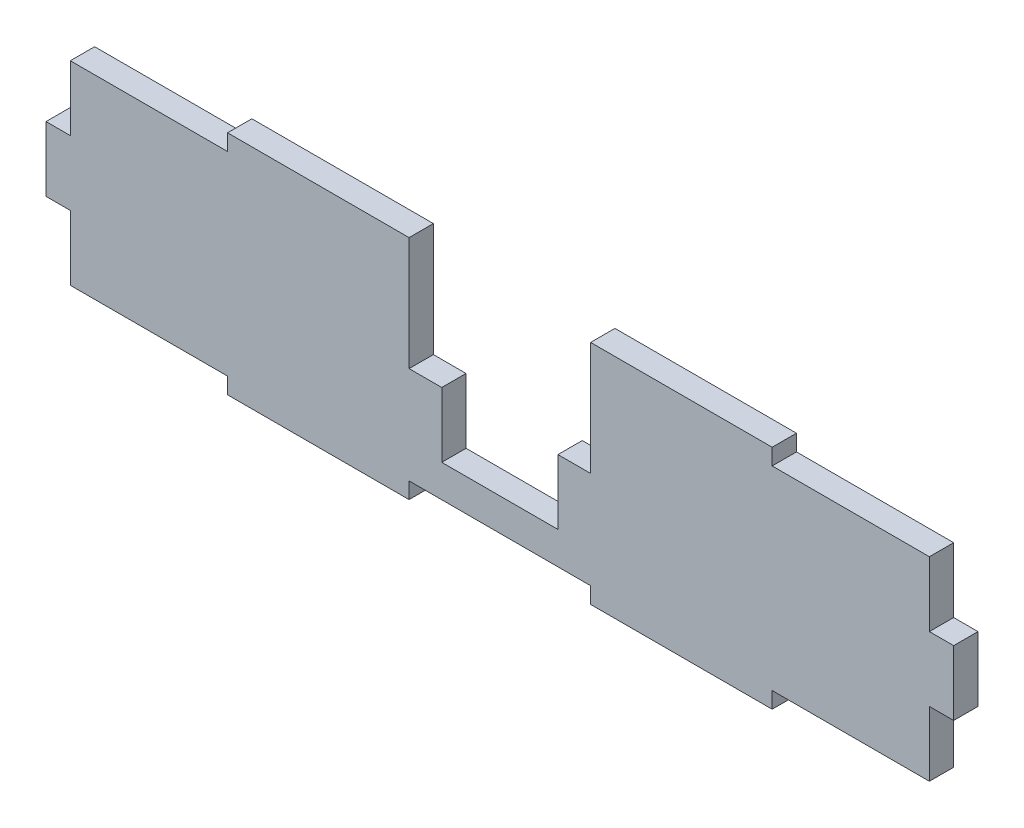
ISO-10303-21;
HEADER;
FILE_DESCRIPTION(('STEP AP214'),'2;1');
FILE_NAME('part.step','',(''),(''),'','','');
FILE_SCHEMA(('AUTOMOTIVE_DESIGN { 1 0 10303 214 1 1 1 1 }'));
ENDSEC;
DATA;
#1=APPLICATION_CONTEXT('core data for automotive mechanical design processes');
#2=APPLICATION_PROTOCOL_DEFINITION('international standard','automotive_design',2000,#1);
#3=PRODUCT_CONTEXT('',#1,'mechanical');
#4=PRODUCT('Part','Part','',(#3));
#5=PRODUCT_RELATED_PRODUCT_CATEGORY('part','',(#4));
#6=PRODUCT_DEFINITION_FORMATION('','',#4);
#7=PRODUCT_DEFINITION_CONTEXT('part definition',#1,'design');
#8=PRODUCT_DEFINITION('design','',#6,#7);
#9=PRODUCT_DEFINITION_SHAPE('','',#8);
#10=(LENGTH_UNIT() NAMED_UNIT(*) SI_UNIT(.MILLI.,.METRE.));
#11=(NAMED_UNIT(*) PLANE_ANGLE_UNIT() SI_UNIT($,.RADIAN.));
#12=(NAMED_UNIT(*) SI_UNIT($,.STERADIAN.) SOLID_ANGLE_UNIT());
#13=UNCERTAINTY_MEASURE_WITH_UNIT(LENGTH_MEASURE(1.E-05),#10,'distance_accuracy_value','');
#14=(GEOMETRIC_REPRESENTATION_CONTEXT(3) GLOBAL_UNCERTAINTY_ASSIGNED_CONTEXT((#13)) GLOBAL_UNIT_ASSIGNED_CONTEXT((#10,
#11,#12)) REPRESENTATION_CONTEXT('',''));
#15=CARTESIAN_POINT('',(0.,0.,0.));
#16=DIRECTION('',(0.,0.,1.));
#17=DIRECTION('',(1.,0.,0.));
#18=AXIS2_PLACEMENT_3D('',#15,#16,#17);
#19=CARTESIAN_POINT('',(0.,-19.5179524149829,9.525));
#20=DIRECTION('',(0.,-1.,0.));
#21=DIRECTION('',(1.,0.,0.));
#22=AXIS2_PLACEMENT_3D('',#19,#20,#21);
#23=PLANE('',#22);
#24=DIRECTION('',(-1.,0.,0.));
#25=VECTOR('',#24,1.);
#26=CARTESIAN_POINT('',(0.,-19.5179524149829,0.));
#27=LINE('',#26,#25);
#28=CARTESIAN_POINT('',(61.9000035909016,-19.5179524149829,0.));
#29=VERTEX_POINT('',#28);
#30=CARTESIAN_POINT('',(16.3825785196252,-19.5179524149829,0.));
#31=VERTEX_POINT('',#30);
#32=EDGE_CURVE('E541',#29,#31,#27,.T.);
#33=ORIENTED_EDGE('',*,*,#32,.T.);
#34=DIRECTION('',(0.,0.,-1.));
#35=VECTOR('',#34,1.);
#36=CARTESIAN_POINT('',(16.3825785196252,-19.5179524149829,9.525));
#37=LINE('',#36,#35);
#38=CARTESIAN_POINT('',(16.3825785196252,-19.5179524149829,9.525));
#39=VERTEX_POINT('',#38);
#40=EDGE_CURVE('E354',#39,#31,#37,.T.);
#41=ORIENTED_EDGE('',*,*,#40,.F.);
#42=DIRECTION('',(-1.,0.,0.));
#43=VECTOR('',#42,1.);
#44=CARTESIAN_POINT('',(0.,-19.5179524149829,9.525));
#45=LINE('',#44,#43);
#46=CARTESIAN_POINT('',(61.9000035909016,-19.5179524149829,9.525));
#47=VERTEX_POINT('',#46);
#48=EDGE_CURVE('E637',#47,#39,#45,.T.);
#49=ORIENTED_EDGE('',*,*,#48,.F.);
#50=DIRECTION('',(0.,0.,-1.));
#51=VECTOR('',#50,1.);
#52=CARTESIAN_POINT('',(61.9000035909016,-19.5179524149829,9.525));
#53=LINE('',#52,#51);
#54=EDGE_CURVE('E321',#47,#29,#53,.T.);
#55=ORIENTED_EDGE('',*,*,#54,.T.);
#56=EDGE_LOOP('',(#33,#41,#49,#55));
#57=FACE_BOUND('',#56,.T.);
#58=ADVANCED_FACE('F233',(#57),#23,.F.);
#59=CARTESIAN_POINT('',(16.3825785196252,0.,9.525));
#60=DIRECTION('',(1.,0.,0.));
#61=DIRECTION('',(0.,1.,0.));
#62=AXIS2_PLACEMENT_3D('',#59,#60,#61);
#63=PLANE('',#62);
#64=DIRECTION('',(0.,-1.,0.));
#65=VECTOR('',#64,1.);
#66=CARTESIAN_POINT('',(16.3825785196252,0.,0.));
#67=LINE('',#66,#65);
#68=CARTESIAN_POINT('',(16.3825785196252,5.88204758501707,0.));
#69=VERTEX_POINT('',#68);
#70=EDGE_CURVE('E537',#69,#31,#67,.T.);
#71=ORIENTED_EDGE('',*,*,#70,.F.);
#72=DIRECTION('',(0.,0.,-1.));
#73=VECTOR('',#72,1.);
#74=CARTESIAN_POINT('',(16.3825785196252,5.88204758501707,9.525));
#75=LINE('',#74,#73);
#76=CARTESIAN_POINT('',(16.3825785196252,5.88204758501707,9.525));
#77=VERTEX_POINT('',#76);
#78=EDGE_CURVE('E358',#77,#69,#75,.T.);
#79=ORIENTED_EDGE('',*,*,#78,.F.);
#80=DIRECTION('',(0.,-1.,0.));
#81=VECTOR('',#80,1.);
#82=CARTESIAN_POINT('',(16.3825785196252,0.,9.525));
#83=LINE('',#82,#81);
#84=EDGE_CURVE('E633',#77,#39,#83,.T.);
#85=ORIENTED_EDGE('',*,*,#84,.T.);
#86=ORIENTED_EDGE('',*,*,#40,.T.);
#87=EDGE_LOOP('',(#71,#79,#85,#86));
#88=FACE_BOUND('',#87,.T.);
#89=ADVANCED_FACE('F1105',(#88),#63,.T.);
#90=CARTESIAN_POINT('',(0.,5.88204758501707,9.525));
#91=DIRECTION('',(0.,1.,0.));
#92=DIRECTION('',(0.,0.,1.));
#93=AXIS2_PLACEMENT_3D('',#90,#91,#92);
#94=PLANE('',#93);
#95=DIRECTION('',(1.,0.,0.));
#96=VECTOR('',#95,1.);
#97=CARTESIAN_POINT('',(0.,5.88204758501707,0.));
#98=LINE('',#97,#96);
#99=CARTESIAN_POINT('',(3.58129105526338,5.88204758501707,0.));
#100=VERTEX_POINT('',#99);
#101=EDGE_CURVE('E533',#100,#69,#98,.T.);
#102=ORIENTED_EDGE('',*,*,#101,.F.);
#103=DIRECTION('',(0.,0.,-1.));
#104=VECTOR('',#103,1.);
#105=CARTESIAN_POINT('',(3.58129105526338,5.88204758501707,9.525));
#106=LINE('',#105,#104);
#107=CARTESIAN_POINT('',(3.58129105526338,5.88204758501707,9.525));
#108=VERTEX_POINT('',#107);
#109=EDGE_CURVE('E362',#108,#100,#106,.T.);
#110=ORIENTED_EDGE('',*,*,#109,.F.);
#111=DIRECTION('',(1.,0.,0.));
#112=VECTOR('',#111,1.);
#113=CARTESIAN_POINT('',(0.,5.88204758501707,9.525));
#114=LINE('',#113,#112);
#115=EDGE_CURVE('E629',#108,#77,#114,.T.);
#116=ORIENTED_EDGE('',*,*,#115,.T.);
#117=ORIENTED_EDGE('',*,*,#78,.T.);
#118=EDGE_LOOP('',(#102,#110,#116,#117));
#119=FACE_BOUND('',#118,.T.);
#120=ADVANCED_FACE('F794',(#119),#94,.T.);
#121=CARTESIAN_POINT('',(3.58129105526338,0.,9.525));
#122=DIRECTION('',(1.,0.,0.));
#123=DIRECTION('',(0.,1.,0.));
#124=AXIS2_PLACEMENT_3D('',#121,#122,#123);
#125=PLANE('',#124);
#126=DIRECTION('',(0.,-1.,0.));
#127=VECTOR('',#126,1.);
#128=CARTESIAN_POINT('',(3.58129105526338,0.,0.));
#129=LINE('',#128,#127);
#130=CARTESIAN_POINT('',(3.58129105526335,50.3320475850171,0.));
#131=VERTEX_POINT('',#130);
#132=EDGE_CURVE('E529',#131,#100,#129,.T.);
#133=ORIENTED_EDGE('',*,*,#132,.F.);
#134=DIRECTION('',(0.,0.,-1.));
#135=VECTOR('',#134,1.);
#136=CARTESIAN_POINT('',(3.58129105526335,50.3320475850171,9.525));
#137=LINE('',#136,#135);
#138=CARTESIAN_POINT('',(3.58129105526335,50.3320475850171,9.525));
#139=VERTEX_POINT('',#138);
#140=EDGE_CURVE('E328',#139,#131,#137,.T.);
#141=ORIENTED_EDGE('',*,*,#140,.F.);
#142=DIRECTION('',(0.,-1.,0.));
#143=VECTOR('',#142,1.);
#144=CARTESIAN_POINT('',(3.58129105526338,0.,9.525));
#145=LINE('',#144,#143);
#146=EDGE_CURVE('E625',#139,#108,#145,.T.);
#147=ORIENTED_EDGE('',*,*,#146,.T.);
#148=ORIENTED_EDGE('',*,*,#109,.T.);
#149=EDGE_LOOP('',(#133,#141,#147,#148));
#150=FACE_BOUND('',#149,.T.);
#151=ADVANCED_FACE('F789',(#150),#125,.T.);
#152=CARTESIAN_POINT('',(0.,43.9820475850171,9.525));
#153=DIRECTION('',(0.,-1.,0.));
#154=DIRECTION('',(1.,0.,0.));
#155=AXIS2_PLACEMENT_3D('',#152,#153,#154);
#156=PLANE('',#155);
#157=DIRECTION('',(-1.,0.,0.));
#158=VECTOR('',#157,1.);
#159=CARTESIAN_POINT('',(0.,43.9820475850171,9.525));
#160=LINE('',#159,#158);
#161=CARTESIAN_POINT('',(-67.5387089447366,43.9820475850171,9.525));
#162=VERTEX_POINT('',#161);
#163=CARTESIAN_POINT('',(-129.133708944737,43.9820475850171,9.525));
#164=VERTEX_POINT('',#163);
#165=EDGE_CURVE('E621',#162,#164,#160,.T.);
#166=ORIENTED_EDGE('',*,*,#165,.F.);
#167=DIRECTION('',(0.,0.,-1.));
#168=VECTOR('',#167,1.);
#169=CARTESIAN_POINT('',(-67.5387089447366,43.9820475850171,9.525));
#170=LINE('',#169,#168);
#171=CARTESIAN_POINT('',(-67.5387089447366,43.9820475850171,0.));
#172=VERTEX_POINT('',#171);
#173=EDGE_CURVE('E12',#162,#172,#170,.T.);
#174=ORIENTED_EDGE('',*,*,#173,.T.);
#175=DIRECTION('',(-1.,0.,0.));
#176=VECTOR('',#175,1.);
#177=CARTESIAN_POINT('',(0.,43.9820475850171,0.));
#178=LINE('',#177,#176);
#179=CARTESIAN_POINT('',(-129.133708944737,43.9820475850171,0.));
#180=VERTEX_POINT('',#179);
#181=EDGE_CURVE('E525',#172,#180,#178,.T.);
#182=ORIENTED_EDGE('',*,*,#181,.T.);
#183=DIRECTION('',(0.,0.,-1.));
#184=VECTOR('',#183,1.);
#185=CARTESIAN_POINT('',(-129.133708944737,43.9820475850171,9.525));
#186=LINE('',#185,#184);
#187=EDGE_CURVE('E366',#164,#180,#186,.T.);
#188=ORIENTED_EDGE('',*,*,#187,.F.);
#189=EDGE_LOOP('',(#166,#174,#182,#188));
#190=FACE_BOUND('',#189,.T.);
#191=ADVANCED_FACE('F700',(#190),#156,.F.);
#192=CARTESIAN_POINT('',(-129.133708944737,0.,9.525));
#193=DIRECTION('',(-1.,0.,0.));
#194=DIRECTION('',(0.,0.,1.));
#195=AXIS2_PLACEMENT_3D('',#192,#193,#194);
#196=PLANE('',#195);
#197=DIRECTION('',(0.,1.,0.));
#198=VECTOR('',#197,1.);
#199=CARTESIAN_POINT('',(-129.133708944737,0.,0.));
#200=LINE('',#199,#198);
#201=CARTESIAN_POINT('',(-129.133708944737,18.582047585017,0.));
#202=VERTEX_POINT('',#201);
#203=EDGE_CURVE('E521',#202,#180,#200,.T.);
#204=ORIENTED_EDGE('',*,*,#203,.F.);
#205=DIRECTION('',(0.,0.,-1.));
#206=VECTOR('',#205,1.);
#207=CARTESIAN_POINT('',(-129.133708944737,18.582047585017,9.525));
#208=LINE('',#207,#206);
#209=CARTESIAN_POINT('',(-129.133708944737,18.582047585017,9.525));
#210=VERTEX_POINT('',#209);
#211=EDGE_CURVE('E370',#210,#202,#208,.T.);
#212=ORIENTED_EDGE('',*,*,#211,.F.);
#213=DIRECTION('',(0.,1.,0.));
#214=VECTOR('',#213,1.);
#215=CARTESIAN_POINT('',(-129.133708944737,0.,9.525));
#216=LINE('',#215,#214);
#217=EDGE_CURVE('E617',#210,#164,#216,.T.);
#218=ORIENTED_EDGE('',*,*,#217,.T.);
#219=ORIENTED_EDGE('',*,*,#187,.T.);
#220=EDGE_LOOP('',(#204,#212,#218,#219));
#221=FACE_BOUND('',#220,.T.);
#222=ADVANCED_FACE('F715',(#221),#196,.T.);
#223=CARTESIAN_POINT('',(0.,18.582047585017,9.525));
#224=DIRECTION('',(0.,1.,0.));
#225=DIRECTION('',(0.,0.,1.));
#226=AXIS2_PLACEMENT_3D('',#223,#224,#225);
#227=PLANE('',#226);
#228=DIRECTION('',(1.,0.,0.));
#229=VECTOR('',#228,1.);
#230=CARTESIAN_POINT('',(0.,18.582047585017,0.));
#231=LINE('',#230,#229);
#232=CARTESIAN_POINT('',(-138.658708944737,18.582047585017,0.));
#233=VERTEX_POINT('',#232);
#234=EDGE_CURVE('E517',#233,#202,#231,.T.);
#235=ORIENTED_EDGE('',*,*,#234,.F.);
#236=DIRECTION('',(0.,0.,-1.));
#237=VECTOR('',#236,1.);
#238=CARTESIAN_POINT('',(-138.658708944737,18.582047585017,9.525));
#239=LINE('',#238,#237);
#240=CARTESIAN_POINT('',(-138.658708944737,18.582047585017,9.525));
#241=VERTEX_POINT('',#240);
#242=EDGE_CURVE('E374',#241,#233,#239,.T.);
#243=ORIENTED_EDGE('',*,*,#242,.F.);
#244=DIRECTION('',(1.,0.,0.));
#245=VECTOR('',#244,1.);
#246=CARTESIAN_POINT('',(0.,18.582047585017,9.525));
#247=LINE('',#246,#245);
#248=EDGE_CURVE('E613',#241,#210,#247,.T.);
#249=ORIENTED_EDGE('',*,*,#248,.T.);
#250=ORIENTED_EDGE('',*,*,#211,.T.);
#251=EDGE_LOOP('',(#235,#243,#249,#250));
#252=FACE_BOUND('',#251,.T.);
#253=ADVANCED_FACE('F845',(#252),#227,.T.);
#254=CARTESIAN_POINT('',(-138.658708944737,0.,9.525));
#255=DIRECTION('',(-1.,0.,0.));
#256=DIRECTION('',(0.,0.,1.));
#257=AXIS2_PLACEMENT_3D('',#254,#255,#256);
#258=PLANE('',#257);
#259=DIRECTION('',(0.,1.,0.));
#260=VECTOR('',#259,1.);
#261=CARTESIAN_POINT('',(-138.658708944737,0.,0.));
#262=LINE('',#261,#260);
#263=CARTESIAN_POINT('',(-138.658708944737,-6.81795241498285,0.));
#264=VERTEX_POINT('',#263);
#265=EDGE_CURVE('E513',#264,#233,#262,.T.);
#266=ORIENTED_EDGE('',*,*,#265,.F.);
#267=DIRECTION('',(0.,0.,-1.));
#268=VECTOR('',#267,1.);
#269=CARTESIAN_POINT('',(-138.658708944737,-6.81795241498285,9.525));
#270=LINE('',#269,#268);
#271=CARTESIAN_POINT('',(-138.658708944737,-6.81795241498285,9.525));
#272=VERTEX_POINT('',#271);
#273=EDGE_CURVE('E378',#272,#264,#270,.T.);
#274=ORIENTED_EDGE('',*,*,#273,.F.);
#275=DIRECTION('',(0.,1.,0.));
#276=VECTOR('',#275,1.);
#277=CARTESIAN_POINT('',(-138.658708944737,0.,9.525));
#278=LINE('',#277,#276);
#279=EDGE_CURVE('E609',#272,#241,#278,.T.);
#280=ORIENTED_EDGE('',*,*,#279,.T.);
#281=ORIENTED_EDGE('',*,*,#242,.T.);
#282=EDGE_LOOP('',(#266,#274,#280,#281));
#283=FACE_BOUND('',#282,.T.);
#284=ADVANCED_FACE('F841',(#283),#258,.T.);
#285=CARTESIAN_POINT('',(0.,-6.81795241498285,9.525));
#286=DIRECTION('',(0.,1.,0.));
#287=DIRECTION('',(0.,0.,1.));
#288=AXIS2_PLACEMENT_3D('',#285,#286,#287);
#289=PLANE('',#288);
#290=DIRECTION('',(1.,0.,0.));
#291=VECTOR('',#290,1.);
#292=CARTESIAN_POINT('',(0.,-6.81795241498285,0.));
#293=LINE('',#292,#291);
#294=CARTESIAN_POINT('',(-129.133708944737,-6.81795241498285,0.));
#295=VERTEX_POINT('',#294);
#296=EDGE_CURVE('E509',#264,#295,#293,.T.);
#297=ORIENTED_EDGE('',*,*,#296,.T.);
#298=DIRECTION('',(0.,0.,-1.));
#299=VECTOR('',#298,1.);
#300=CARTESIAN_POINT('',(-129.133708944737,-6.81795241498285,9.525));
#301=LINE('',#300,#299);
#302=CARTESIAN_POINT('',(-129.133708944737,-6.81795241498285,9.525));
#303=VERTEX_POINT('',#302);
#304=EDGE_CURVE('E382',#303,#295,#301,.T.);
#305=ORIENTED_EDGE('',*,*,#304,.F.);
#306=DIRECTION('',(1.,0.,0.));
#307=VECTOR('',#306,1.);
#308=CARTESIAN_POINT('',(0.,-6.81795241498285,9.525));
#309=LINE('',#308,#307);
#310=EDGE_CURVE('E605',#272,#303,#309,.T.);
#311=ORIENTED_EDGE('',*,*,#310,.F.);
#312=ORIENTED_EDGE('',*,*,#273,.T.);
#313=EDGE_LOOP('',(#297,#305,#311,#312));
#314=FACE_BOUND('',#313,.T.);
#315=ADVANCED_FACE('F852',(#314),#289,.F.);
#316=CARTESIAN_POINT('',(-129.133708944737,0.,9.525));
#317=DIRECTION('',(1.,0.,0.));
#318=DIRECTION('',(0.,0.,-1.));
#319=AXIS2_PLACEMENT_3D('',#316,#317,#318);
#320=PLANE('',#319);
#321=DIRECTION('',(0.,-1.,0.));
#322=VECTOR('',#321,1.);
#323=CARTESIAN_POINT('',(-129.133708944737,0.,0.));
#324=LINE('',#323,#322);
#325=CARTESIAN_POINT('',(-129.133708944737,-32.2179524149829,0.));
#326=VERTEX_POINT('',#325);
#327=EDGE_CURVE('E505',#295,#326,#324,.T.);
#328=ORIENTED_EDGE('',*,*,#327,.T.);
#329=DIRECTION('',(0.,0.,-1.));
#330=VECTOR('',#329,1.);
#331=CARTESIAN_POINT('',(-129.133708944737,-32.2179524149829,9.525));
#332=LINE('',#331,#330);
#333=CARTESIAN_POINT('',(-129.133708944737,-32.2179524149829,9.525));
#334=VERTEX_POINT('',#333);
#335=EDGE_CURVE('E386',#334,#326,#332,.T.);
#336=ORIENTED_EDGE('',*,*,#335,.F.);
#337=DIRECTION('',(0.,-1.,0.));
#338=VECTOR('',#337,1.);
#339=CARTESIAN_POINT('',(-129.133708944737,0.,9.525));
#340=LINE('',#339,#338);
#341=EDGE_CURVE('E601',#303,#334,#340,.T.);
#342=ORIENTED_EDGE('',*,*,#341,.F.);
#343=ORIENTED_EDGE('',*,*,#304,.T.);
#344=EDGE_LOOP('',(#328,#336,#342,#343));
#345=FACE_BOUND('',#344,.T.);
#346=ADVANCED_FACE('F835',(#345),#320,.F.);
#347=CARTESIAN_POINT('',(0.,-32.2179524149829,9.525));
#348=DIRECTION('',(0.,-1.,0.));
#349=DIRECTION('',(0.,0.,-1.));
#350=AXIS2_PLACEMENT_3D('',#347,#348,#349);
#351=PLANE('',#350);
#352=DIRECTION('',(-1.,0.,0.));
#353=VECTOR('',#352,1.);
#354=CARTESIAN_POINT('',(0.,-32.2179524149829,0.));
#355=LINE('',#354,#353);
#356=CARTESIAN_POINT('',(-67.5387089447366,-32.2179524149829,0.));
#357=VERTEX_POINT('',#356);
#358=EDGE_CURVE('E501',#357,#326,#355,.T.);
#359=ORIENTED_EDGE('',*,*,#358,.F.);
#360=DIRECTION('',(0.,0.,-1.));
#361=VECTOR('',#360,1.);
#362=CARTESIAN_POINT('',(-67.5387089447366,-32.2179524149829,9.525));
#363=LINE('',#362,#361);
#364=CARTESIAN_POINT('',(-67.5387089447366,-32.2179524149829,9.525));
#365=VERTEX_POINT('',#364);
#366=EDGE_CURVE('E390',#365,#357,#363,.T.);
#367=ORIENTED_EDGE('',*,*,#366,.F.);
#368=DIRECTION('',(-1.,0.,0.));
#369=VECTOR('',#368,1.);
#370=CARTESIAN_POINT('',(0.,-32.2179524149829,9.525));
#371=LINE('',#370,#369);
#372=EDGE_CURVE('E597',#365,#334,#371,.T.);
#373=ORIENTED_EDGE('',*,*,#372,.T.);
#374=ORIENTED_EDGE('',*,*,#335,.T.);
#375=EDGE_LOOP('',(#359,#367,#373,#374));
#376=FACE_BOUND('',#375,.T.);
#377=ADVANCED_FACE('F831',(#376),#351,.T.);
#378=CARTESIAN_POINT('',(-67.5387089447366,1.47604389220283E-13,9.525));
#379=DIRECTION('',(1.,0.,0.));
#380=DIRECTION('',(0.,1.,0.));
#381=AXIS2_PLACEMENT_3D('',#378,#379,#380);
#382=PLANE('',#381);
#383=DIRECTION('',(0.,-1.,0.));
#384=VECTOR('',#383,1.);
#385=CARTESIAN_POINT('',(-67.5387089447366,1.47604389220283E-13,0.));
#386=LINE('',#385,#384);
#387=CARTESIAN_POINT('',(-67.5387089447366,-38.5679524149829,0.));
#388=VERTEX_POINT('',#387);
#389=EDGE_CURVE('E497',#357,#388,#386,.T.);
#390=ORIENTED_EDGE('',*,*,#389,.T.);
#391=DIRECTION('',(0.,0.,-1.));
#392=VECTOR('',#391,1.);
#393=CARTESIAN_POINT('',(-67.5387089447366,-38.5679524149829,9.525));
#394=LINE('',#393,#392);
#395=CARTESIAN_POINT('',(-67.5387089447366,-38.5679524149829,9.525));
#396=VERTEX_POINT('',#395);
#397=EDGE_CURVE('E394',#396,#388,#394,.T.);
#398=ORIENTED_EDGE('',*,*,#397,.F.);
#399=DIRECTION('',(0.,-1.,0.));
#400=VECTOR('',#399,1.);
#401=CARTESIAN_POINT('',(-67.5387089447366,1.47604389220283E-13,9.525));
#402=LINE('',#401,#400);
#403=EDGE_CURVE('E593',#365,#396,#402,.T.);
#404=ORIENTED_EDGE('',*,*,#403,.F.);
#405=ORIENTED_EDGE('',*,*,#366,.T.);
#406=EDGE_LOOP('',(#390,#398,#404,#405));
#407=FACE_BOUND('',#406,.T.);
#408=ADVANCED_FACE('F827',(#407),#382,.F.);
#409=CARTESIAN_POINT('',(0.,-38.5679524149829,9.525));
#410=DIRECTION('',(0.,1.,0.));
#411=DIRECTION('',(0.,0.,1.));
#412=AXIS2_PLACEMENT_3D('',#409,#410,#411);
#413=PLANE('',#412);
#414=DIRECTION('',(1.,0.,0.));
#415=VECTOR('',#414,1.);
#416=CARTESIAN_POINT('',(0.,-38.5679524149829,0.));
#417=LINE('',#416,#415);
#418=CARTESIAN_POINT('',(3.58129105526335,-38.5679524149829,0.));
#419=VERTEX_POINT('',#418);
#420=EDGE_CURVE('E493',#388,#419,#417,.T.);
#421=ORIENTED_EDGE('',*,*,#420,.T.);
#422=DIRECTION('',(0.,0.,-1.));
#423=VECTOR('',#422,1.);
#424=CARTESIAN_POINT('',(3.58129105526335,-38.5679524149829,9.525));
#425=LINE('',#424,#423);
#426=CARTESIAN_POINT('',(3.58129105526335,-38.5679524149829,9.525));
#427=VERTEX_POINT('',#426);
#428=EDGE_CURVE('E398',#427,#419,#425,.T.);
#429=ORIENTED_EDGE('',*,*,#428,.F.);
#430=DIRECTION('',(1.,0.,0.));
#431=VECTOR('',#430,1.);
#432=CARTESIAN_POINT('',(0.,-38.5679524149829,9.525));
#433=LINE('',#432,#431);
#434=EDGE_CURVE('E589',#396,#427,#433,.T.);
#435=ORIENTED_EDGE('',*,*,#434,.F.);
#436=ORIENTED_EDGE('',*,*,#397,.T.);
#437=EDGE_LOOP('',(#421,#429,#435,#436));
#438=FACE_BOUND('',#437,.T.);
#439=ADVANCED_FACE('F735',(#438),#413,.F.);
#440=CARTESIAN_POINT('',(3.58129105526335,0.,9.525));
#441=DIRECTION('',(-1.,0.,0.));
#442=DIRECTION('',(0.,0.,1.));
#443=AXIS2_PLACEMENT_3D('',#440,#441,#442);
#444=PLANE('',#443);
#445=DIRECTION('',(0.,1.,0.));
#446=VECTOR('',#445,1.);
#447=CARTESIAN_POINT('',(3.58129105526335,0.,0.));
#448=LINE('',#447,#446);
#449=CARTESIAN_POINT('',(3.58129105526335,-32.2179524149829,0.));
#450=VERTEX_POINT('',#449);
#451=EDGE_CURVE('E489',#419,#450,#448,.T.);
#452=ORIENTED_EDGE('',*,*,#451,.T.);
#453=DIRECTION('',(0.,0.,-1.));
#454=VECTOR('',#453,1.);
#455=CARTESIAN_POINT('',(3.58129105526335,-32.2179524149829,9.525));
#456=LINE('',#455,#454);
#457=CARTESIAN_POINT('',(3.58129105526335,-32.2179524149829,9.525));
#458=VERTEX_POINT('',#457);
#459=EDGE_CURVE('E402',#458,#450,#456,.T.);
#460=ORIENTED_EDGE('',*,*,#459,.F.);
#461=DIRECTION('',(0.,1.,0.));
#462=VECTOR('',#461,1.);
#463=CARTESIAN_POINT('',(3.58129105526335,0.,9.525));
#464=LINE('',#463,#462);
#465=EDGE_CURVE('E585',#427,#458,#464,.T.);
#466=ORIENTED_EDGE('',*,*,#465,.F.);
#467=ORIENTED_EDGE('',*,*,#428,.T.);
#468=EDGE_LOOP('',(#452,#460,#466,#467));
#469=FACE_BOUND('',#468,.T.);
#470=ADVANCED_FACE('F742',(#469),#444,.F.);
#471=CARTESIAN_POINT('',(74.7012910552634,-32.2179524149829,0.));
#472=VERTEX_POINT('',#471);
#473=EDGE_CURVE('E488',#472,#450,#355,.T.);
#474=ORIENTED_EDGE('',*,*,#473,.F.);
#475=DIRECTION('',(0.,0.,-1.));
#476=VECTOR('',#475,1.);
#477=CARTESIAN_POINT('',(74.7012910552634,-32.2179524149829,9.525));
#478=LINE('',#477,#476);
#479=CARTESIAN_POINT('',(74.7012910552634,-32.2179524149829,9.525));
#480=VERTEX_POINT('',#479);
#481=EDGE_CURVE('E406',#480,#472,#478,.T.);
#482=ORIENTED_EDGE('',*,*,#481,.F.);
#483=EDGE_CURVE('E584',#480,#458,#371,.T.);
#484=ORIENTED_EDGE('',*,*,#483,.T.);
#485=ORIENTED_EDGE('',*,*,#459,.T.);
#486=EDGE_LOOP('',(#474,#482,#484,#485));
#487=FACE_BOUND('',#486,.T.);
#488=ADVANCED_FACE('F665',(#487),#351,.T.);
#489=CARTESIAN_POINT('',(74.7012910552634,0.,9.525));
#490=DIRECTION('',(-1.,0.,0.));
#491=DIRECTION('',(0.,0.,1.));
#492=AXIS2_PLACEMENT_3D('',#489,#490,#491);
#493=PLANE('',#492);
#494=DIRECTION('',(0.,1.,0.));
#495=VECTOR('',#494,1.);
#496=CARTESIAN_POINT('',(74.7012910552634,0.,0.));
#497=LINE('',#496,#495);
#498=CARTESIAN_POINT('',(74.7012910552634,-38.5679524149829,0.));
#499=VERTEX_POINT('',#498);
#500=EDGE_CURVE('E484',#499,#472,#497,.T.);
#501=ORIENTED_EDGE('',*,*,#500,.F.);
#502=DIRECTION('',(0.,0.,-1.));
#503=VECTOR('',#502,1.);
#504=CARTESIAN_POINT('',(74.7012910552634,-38.5679524149829,9.525));
#505=LINE('',#504,#503);
#506=CARTESIAN_POINT('',(74.7012910552634,-38.5679524149829,9.525));
#507=VERTEX_POINT('',#506);
#508=EDGE_CURVE('E410',#507,#499,#505,.T.);
#509=ORIENTED_EDGE('',*,*,#508,.F.);
#510=DIRECTION('',(0.,1.,0.));
#511=VECTOR('',#510,1.);
#512=CARTESIAN_POINT('',(74.7012910552634,0.,9.525));
#513=LINE('',#512,#511);
#514=EDGE_CURVE('E580',#507,#480,#513,.T.);
#515=ORIENTED_EDGE('',*,*,#514,.T.);
#516=ORIENTED_EDGE('',*,*,#481,.T.);
#517=EDGE_LOOP('',(#501,#509,#515,#516));
#518=FACE_BOUND('',#517,.T.);
#519=ADVANCED_FACE('F899',(#518),#493,.T.);
#520=CARTESIAN_POINT('',(0.,-38.5679524149829,9.525));
#521=DIRECTION('',(0.,-1.,0.));
#522=DIRECTION('',(0.,0.,-1.));
#523=AXIS2_PLACEMENT_3D('',#520,#521,#522);
#524=PLANE('',#523);
#525=DIRECTION('',(-1.,0.,0.));
#526=VECTOR('',#525,1.);
#527=CARTESIAN_POINT('',(0.,-38.5679524149829,0.));
#528=LINE('',#527,#526);
#529=CARTESIAN_POINT('',(145.821291055263,-38.5679524149829,0.));
#530=VERTEX_POINT('',#529);
#531=EDGE_CURVE('E480',#530,#499,#528,.T.);
#532=ORIENTED_EDGE('',*,*,#531,.F.);
#533=DIRECTION('',(0.,0.,-1.));
#534=VECTOR('',#533,1.);
#535=CARTESIAN_POINT('',(145.821291055263,-38.5679524149829,9.525));
#536=LINE('',#535,#534);
#537=CARTESIAN_POINT('',(145.821291055263,-38.5679524149829,9.525));
#538=VERTEX_POINT('',#537);
#539=EDGE_CURVE('E414',#538,#530,#536,.T.);
#540=ORIENTED_EDGE('',*,*,#539,.F.);
#541=DIRECTION('',(-1.,0.,0.));
#542=VECTOR('',#541,1.);
#543=CARTESIAN_POINT('',(0.,-38.5679524149829,9.525));
#544=LINE('',#543,#542);
#545=EDGE_CURVE('E576',#538,#507,#544,.T.);
#546=ORIENTED_EDGE('',*,*,#545,.T.);
#547=ORIENTED_EDGE('',*,*,#508,.T.);
#548=EDGE_LOOP('',(#532,#540,#546,#547));
#549=FACE_BOUND('',#548,.T.);
#550=ADVANCED_FACE('F897',(#549),#524,.T.);
#551=CARTESIAN_POINT('',(145.821291055263,0.,9.525));
#552=DIRECTION('',(1.,0.,0.));
#553=DIRECTION('',(0.,0.,-1.));
#554=AXIS2_PLACEMENT_3D('',#551,#552,#553);
#555=PLANE('',#554);
#556=DIRECTION('',(0.,-1.,0.));
#557=VECTOR('',#556,1.);
#558=CARTESIAN_POINT('',(145.821291055263,0.,0.));
#559=LINE('',#558,#557);
#560=CARTESIAN_POINT('',(145.821291055263,-32.2179524149829,0.));
#561=VERTEX_POINT('',#560);
#562=EDGE_CURVE('E476',#561,#530,#559,.T.);
#563=ORIENTED_EDGE('',*,*,#562,.F.);
#564=DIRECTION('',(0.,0.,-1.));
#565=VECTOR('',#564,1.);
#566=CARTESIAN_POINT('',(145.821291055263,-32.2179524149829,9.525));
#567=LINE('',#566,#565);
#568=CARTESIAN_POINT('',(145.821291055263,-32.2179524149829,9.525));
#569=VERTEX_POINT('',#568);
#570=EDGE_CURVE('E418',#569,#561,#567,.T.);
#571=ORIENTED_EDGE('',*,*,#570,.F.);
#572=DIRECTION('',(0.,-1.,0.));
#573=VECTOR('',#572,1.);
#574=CARTESIAN_POINT('',(145.821291055263,0.,9.525));
#575=LINE('',#574,#573);
#576=EDGE_CURVE('E572',#569,#538,#575,.T.);
#577=ORIENTED_EDGE('',*,*,#576,.T.);
#578=ORIENTED_EDGE('',*,*,#539,.T.);
#579=EDGE_LOOP('',(#563,#571,#577,#578));
#580=FACE_BOUND('',#579,.T.);
#581=ADVANCED_FACE('F894',(#580),#555,.T.);
#582=CARTESIAN_POINT('',(207.416291055263,-32.2179524149829,0.));
#583=VERTEX_POINT('',#582);
#584=EDGE_CURVE('E475',#583,#561,#355,.T.);
#585=ORIENTED_EDGE('',*,*,#584,.F.);
#586=DIRECTION('',(0.,0.,-1.));
#587=VECTOR('',#586,1.);
#588=CARTESIAN_POINT('',(207.416291055263,-32.2179524149829,9.525));
#589=LINE('',#588,#587);
#590=CARTESIAN_POINT('',(207.416291055263,-32.2179524149829,9.525));
#591=VERTEX_POINT('',#590);
#592=EDGE_CURVE('E422',#591,#583,#589,.T.);
#593=ORIENTED_EDGE('',*,*,#592,.F.);
#594=EDGE_CURVE('E571',#591,#569,#371,.T.);
#595=ORIENTED_EDGE('',*,*,#594,.T.);
#596=ORIENTED_EDGE('',*,*,#570,.T.);
#597=EDGE_LOOP('',(#585,#593,#595,#596));
#598=FACE_BOUND('',#597,.T.);
#599=ADVANCED_FACE('F890',(#598),#351,.T.);
#600=CARTESIAN_POINT('',(207.416291055263,0.,9.525));
#601=DIRECTION('',(1.,0.,0.));
#602=DIRECTION('',(0.,0.,-1.));
#603=AXIS2_PLACEMENT_3D('',#600,#601,#602);
#604=PLANE('',#603);
#605=DIRECTION('',(0.,-1.,0.));
#606=VECTOR('',#605,1.);
#607=CARTESIAN_POINT('',(207.416291055263,0.,0.));
#608=LINE('',#607,#606);
#609=CARTESIAN_POINT('',(207.416291055263,-6.81795241498297,0.));
#610=VERTEX_POINT('',#609);
#611=EDGE_CURVE('E471',#610,#583,#608,.T.);
#612=ORIENTED_EDGE('',*,*,#611,.F.);
#613=DIRECTION('',(0.,0.,-1.));
#614=VECTOR('',#613,1.);
#615=CARTESIAN_POINT('',(207.416291055263,-6.81795241498297,9.525));
#616=LINE('',#615,#614);
#617=CARTESIAN_POINT('',(207.416291055263,-6.81795241498297,9.525));
#618=VERTEX_POINT('',#617);
#619=EDGE_CURVE('E426',#618,#610,#616,.T.);
#620=ORIENTED_EDGE('',*,*,#619,.F.);
#621=DIRECTION('',(0.,-1.,0.));
#622=VECTOR('',#621,1.);
#623=CARTESIAN_POINT('',(207.416291055263,0.,9.525));
#624=LINE('',#623,#622);
#625=EDGE_CURVE('E567',#618,#591,#624,.T.);
#626=ORIENTED_EDGE('',*,*,#625,.T.);
#627=ORIENTED_EDGE('',*,*,#592,.T.);
#628=EDGE_LOOP('',(#612,#620,#626,#627));
#629=FACE_BOUND('',#628,.T.);
#630=ADVANCED_FACE('F885',(#629),#604,.T.);
#631=CARTESIAN_POINT('',(0.,-6.81795241498297,9.525));
#632=DIRECTION('',(0.,-1.,0.));
#633=DIRECTION('',(0.,0.,-1.));
#634=AXIS2_PLACEMENT_3D('',#631,#632,#633);
#635=PLANE('',#634);
#636=DIRECTION('',(-1.,0.,0.));
#637=VECTOR('',#636,1.);
#638=CARTESIAN_POINT('',(0.,-6.81795241498297,0.));
#639=LINE('',#638,#637);
#640=CARTESIAN_POINT('',(216.941291055263,-6.81795241498297,0.));
#641=VERTEX_POINT('',#640);
#642=EDGE_CURVE('E467',#641,#610,#639,.T.);
#643=ORIENTED_EDGE('',*,*,#642,.F.);
#644=DIRECTION('',(0.,0.,-1.));
#645=VECTOR('',#644,1.);
#646=CARTESIAN_POINT('',(216.941291055263,-6.81795241498297,9.525));
#647=LINE('',#646,#645);
#648=CARTESIAN_POINT('',(216.941291055263,-6.81795241498297,9.525));
#649=VERTEX_POINT('',#648);
#650=EDGE_CURVE('E430',#649,#641,#647,.T.);
#651=ORIENTED_EDGE('',*,*,#650,.F.);
#652=DIRECTION('',(-1.,0.,0.));
#653=VECTOR('',#652,1.);
#654=CARTESIAN_POINT('',(0.,-6.81795241498297,9.525));
#655=LINE('',#654,#653);
#656=EDGE_CURVE('E563',#649,#618,#655,.T.);
#657=ORIENTED_EDGE('',*,*,#656,.T.);
#658=ORIENTED_EDGE('',*,*,#619,.T.);
#659=EDGE_LOOP('',(#643,#651,#657,#658));
#660=FACE_BOUND('',#659,.T.);
#661=ADVANCED_FACE('F881',(#660),#635,.T.);
#662=CARTESIAN_POINT('',(216.941291055263,-1.58040168189935E-13,9.525));
#663=DIRECTION('',(1.,0.,0.));
#664=DIRECTION('',(0.,1.,0.));
#665=AXIS2_PLACEMENT_3D('',#662,#663,#664);
#666=PLANE('',#665);
#667=DIRECTION('',(0.,-1.,0.));
#668=VECTOR('',#667,1.);
#669=CARTESIAN_POINT('',(216.941291055263,-1.58040168189935E-13,0.));
#670=LINE('',#669,#668);
#671=CARTESIAN_POINT('',(216.941291055263,18.5820475850169,0.));
#672=VERTEX_POINT('',#671);
#673=EDGE_CURVE('E463',#672,#641,#670,.T.);
#674=ORIENTED_EDGE('',*,*,#673,.F.);
#675=DIRECTION('',(0.,0.,-1.));
#676=VECTOR('',#675,1.);
#677=CARTESIAN_POINT('',(216.941291055263,18.5820475850169,9.525));
#678=LINE('',#677,#676);
#679=CARTESIAN_POINT('',(216.941291055263,18.5820475850169,9.525));
#680=VERTEX_POINT('',#679);
#681=EDGE_CURVE('E434',#680,#672,#678,.T.);
#682=ORIENTED_EDGE('',*,*,#681,.F.);
#683=DIRECTION('',(0.,-1.,0.));
#684=VECTOR('',#683,1.);
#685=CARTESIAN_POINT('',(216.941291055263,-1.58040168189935E-13,9.525));
#686=LINE('',#685,#684);
#687=EDGE_CURVE('E559',#680,#649,#686,.T.);
#688=ORIENTED_EDGE('',*,*,#687,.T.);
#689=ORIENTED_EDGE('',*,*,#650,.T.);
#690=EDGE_LOOP('',(#674,#682,#688,#689));
#691=FACE_BOUND('',#690,.T.);
#692=ADVANCED_FACE('F875',(#691),#666,.T.);
#693=CARTESIAN_POINT('',(0.,18.582047585017,9.525));
#694=DIRECTION('',(0.,-1.,0.));
#695=DIRECTION('',(1.,0.,0.));
#696=AXIS2_PLACEMENT_3D('',#693,#694,#695);
#697=PLANE('',#696);
#698=DIRECTION('',(-1.,0.,0.));
#699=VECTOR('',#698,1.);
#700=CARTESIAN_POINT('',(0.,18.582047585017,0.));
#701=LINE('',#700,#699);
#702=CARTESIAN_POINT('',(207.416291055263,18.5820475850169,0.));
#703=VERTEX_POINT('',#702);
#704=EDGE_CURVE('E459',#672,#703,#701,.T.);
#705=ORIENTED_EDGE('',*,*,#704,.T.);
#706=DIRECTION('',(0.,0.,-1.));
#707=VECTOR('',#706,1.);
#708=CARTESIAN_POINT('',(207.416291055263,18.5820475850169,9.525));
#709=LINE('',#708,#707);
#710=CARTESIAN_POINT('',(207.416291055263,18.5820475850169,9.525));
#711=VERTEX_POINT('',#710);
#712=EDGE_CURVE('E438',#711,#703,#709,.T.);
#713=ORIENTED_EDGE('',*,*,#712,.F.);
#714=DIRECTION('',(-1.,0.,0.));
#715=VECTOR('',#714,1.);
#716=CARTESIAN_POINT('',(0.,18.582047585017,9.525));
#717=LINE('',#716,#715);
#718=EDGE_CURVE('E555',#680,#711,#717,.T.);
#719=ORIENTED_EDGE('',*,*,#718,.F.);
#720=ORIENTED_EDGE('',*,*,#681,.T.);
#721=EDGE_LOOP('',(#705,#713,#719,#720));
#722=FACE_BOUND('',#721,.T.);
#723=ADVANCED_FACE('F1000',(#722),#697,.F.);
#724=CARTESIAN_POINT('',(207.416291055263,0.,9.525));
#725=DIRECTION('',(-1.,0.,0.));
#726=DIRECTION('',(0.,0.,1.));
#727=AXIS2_PLACEMENT_3D('',#724,#725,#726);
#728=PLANE('',#727);
#729=DIRECTION('',(0.,1.,0.));
#730=VECTOR('',#729,1.);
#731=CARTESIAN_POINT('',(207.416291055263,0.,0.));
#732=LINE('',#731,#730);
#733=CARTESIAN_POINT('',(207.416291055263,43.9820475850171,0.));
#734=VERTEX_POINT('',#733);
#735=EDGE_CURVE('E455',#703,#734,#732,.T.);
#736=ORIENTED_EDGE('',*,*,#735,.T.);
#737=DIRECTION('',(0.,0.,-1.));
#738=VECTOR('',#737,1.);
#739=CARTESIAN_POINT('',(207.416291055263,43.9820475850171,9.525));
#740=LINE('',#739,#738);
#741=CARTESIAN_POINT('',(207.416291055263,43.9820475850171,9.525));
#742=VERTEX_POINT('',#741);
#743=EDGE_CURVE('E442',#742,#734,#740,.T.);
#744=ORIENTED_EDGE('',*,*,#743,.F.);
#745=DIRECTION('',(0.,1.,0.));
#746=VECTOR('',#745,1.);
#747=CARTESIAN_POINT('',(207.416291055263,0.,9.525));
#748=LINE('',#747,#746);
#749=EDGE_CURVE('E551',#711,#742,#748,.T.);
#750=ORIENTED_EDGE('',*,*,#749,.F.);
#751=ORIENTED_EDGE('',*,*,#712,.T.);
#752=EDGE_LOOP('',(#736,#744,#750,#751));
#753=FACE_BOUND('',#752,.T.);
#754=ADVANCED_FACE('F869',(#753),#728,.F.);
#755=DIRECTION('',(0.,0.,-1.));
#756=VECTOR('',#755,1.);
#757=CARTESIAN_POINT('',(145.821291055263,43.9820475850171,9.525));
#758=LINE('',#757,#756);
#759=CARTESIAN_POINT('',(145.821291055263,43.9820475850171,9.525));
#760=VERTEX_POINT('',#759);
#761=CARTESIAN_POINT('',(145.821291055263,43.9820475850171,0.));
#762=VERTEX_POINT('',#761);
#763=EDGE_CURVE('E244',#760,#762,#758,.T.);
#764=ORIENTED_EDGE('',*,*,#763,.F.);
#765=EDGE_CURVE('E550',#742,#760,#160,.T.);
#766=ORIENTED_EDGE('',*,*,#765,.F.);
#767=ORIENTED_EDGE('',*,*,#743,.T.);
#768=EDGE_CURVE('E297',#734,#762,#178,.T.);
#769=ORIENTED_EDGE('',*,*,#768,.T.);
#770=EDGE_LOOP('',(#764,#766,#767,#769));
#771=FACE_BOUND('',#770,.T.);
#772=ADVANCED_FACE('F864',(#771),#156,.F.);
#773=CARTESIAN_POINT('',(74.7012910552634,0.,9.525));
#774=DIRECTION('',(-1.,0.,0.));
#775=DIRECTION('',(0.,-1.,0.));
#776=AXIS2_PLACEMENT_3D('',#773,#774,#775);
#777=PLANE('',#776);
#778=DIRECTION('',(0.,1.,0.));
#779=VECTOR('',#778,1.);
#780=CARTESIAN_POINT('',(74.7012910552634,0.,0.));
#781=LINE('',#780,#779);
#782=CARTESIAN_POINT('',(74.7012910552634,5.88204758501707,0.));
#783=VERTEX_POINT('',#782);
#784=CARTESIAN_POINT('',(74.7012910552634,50.3320475850171,0.));
#785=VERTEX_POINT('',#784);
#786=EDGE_CURVE('E287',#783,#785,#781,.T.);
#787=ORIENTED_EDGE('',*,*,#786,.F.);
#788=DIRECTION('',(0.,0.,-1.));
#789=VECTOR('',#788,1.);
#790=CARTESIAN_POINT('',(74.7012910552634,5.88204758501707,9.525));
#791=LINE('',#790,#789);
#792=CARTESIAN_POINT('',(74.7012910552634,5.88204758501707,9.525));
#793=VERTEX_POINT('',#792);
#794=EDGE_CURVE('E446',#793,#783,#791,.T.);
#795=ORIENTED_EDGE('',*,*,#794,.F.);
#796=DIRECTION('',(0.,1.,0.));
#797=VECTOR('',#796,1.);
#798=CARTESIAN_POINT('',(74.7012910552634,0.,9.525));
#799=LINE('',#798,#797);
#800=CARTESIAN_POINT('',(74.7012910552634,50.3320475850171,9.525));
#801=VERTEX_POINT('',#800);
#802=EDGE_CURVE('E311',#793,#801,#799,.T.);
#803=ORIENTED_EDGE('',*,*,#802,.T.);
#804=DIRECTION('',(0.,0.,-1.));
#805=VECTOR('',#804,1.);
#806=CARTESIAN_POINT('',(74.7012910552634,50.3320475850171,9.525));
#807=LINE('',#806,#805);
#808=EDGE_CURVE('E302',#801,#785,#807,.T.);
#809=ORIENTED_EDGE('',*,*,#808,.T.);
#810=EDGE_LOOP('',(#787,#795,#803,#809));
#811=FACE_BOUND('',#810,.T.);
#812=ADVANCED_FACE('F309',(#811),#777,.T.);
#813=CARTESIAN_POINT('',(61.9000035909016,5.88204758501707,0.));
#814=VERTEX_POINT('',#813);
#815=EDGE_CURVE('E292',#814,#783,#98,.T.);
#816=ORIENTED_EDGE('',*,*,#815,.F.);
#817=DIRECTION('',(0.,0.,-1.));
#818=VECTOR('',#817,1.);
#819=CARTESIAN_POINT('',(61.9000035909016,5.88204758501707,9.525));
#820=LINE('',#819,#818);
#821=CARTESIAN_POINT('',(61.9000035909016,5.88204758501707,9.525));
#822=VERTEX_POINT('',#821);
#823=EDGE_CURVE('E450',#822,#814,#820,.T.);
#824=ORIENTED_EDGE('',*,*,#823,.F.);
#825=EDGE_CURVE('E453',#822,#793,#114,.T.);
#826=ORIENTED_EDGE('',*,*,#825,.T.);
#827=ORIENTED_EDGE('',*,*,#794,.T.);
#828=EDGE_LOOP('',(#816,#824,#826,#827));
#829=FACE_BOUND('',#828,.T.);
#830=ADVANCED_FACE('F1035',(#829),#94,.T.);
#831=CARTESIAN_POINT('',(61.9000035909016,0.,9.525));
#832=DIRECTION('',(1.,0.,0.));
#833=DIRECTION('',(0.,0.,-1.));
#834=AXIS2_PLACEMENT_3D('',#831,#832,#833);
#835=PLANE('',#834);
#836=DIRECTION('',(0.,-1.,0.));
#837=VECTOR('',#836,1.);
#838=CARTESIAN_POINT('',(61.9000035909016,0.,0.));
#839=LINE('',#838,#837);
#840=EDGE_CURVE('E336',#814,#29,#839,.T.);
#841=ORIENTED_EDGE('',*,*,#840,.T.);
#842=ORIENTED_EDGE('',*,*,#54,.F.);
#843=DIRECTION('',(0.,-1.,0.));
#844=VECTOR('',#843,1.);
#845=CARTESIAN_POINT('',(61.9000035909016,0.,9.525));
#846=LINE('',#845,#844);
#847=EDGE_CURVE('E641',#822,#47,#846,.T.);
#848=ORIENTED_EDGE('',*,*,#847,.F.);
#849=ORIENTED_EDGE('',*,*,#823,.T.);
#850=EDGE_LOOP('',(#841,#842,#848,#849));
#851=FACE_BOUND('',#850,.T.);
#852=ADVANCED_FACE('F1044',(#851),#835,.F.);
#853=CARTESIAN_POINT('',(0.,0.,0.));
#854=DIRECTION('',(0.,0.,1.));
#855=DIRECTION('',(1.,0.,0.));
#856=AXIS2_PLACEMENT_3D('',#853,#854,#855);
#857=PLANE('',#856);
#858=ORIENTED_EDGE('',*,*,#840,.F.);
#859=ORIENTED_EDGE('',*,*,#815,.T.);
#860=ORIENTED_EDGE('',*,*,#786,.T.);
#861=DIRECTION('',(-1.,0.,0.));
#862=VECTOR('',#861,1.);
#863=CARTESIAN_POINT('',(145.821291055263,50.3320475850171,0.));
#864=LINE('',#863,#862);
#865=CARTESIAN_POINT('',(145.821291055263,50.3320475850171,0.));
#866=VERTEX_POINT('',#865);
#867=EDGE_CURVE('E283',#866,#785,#864,.T.);
#868=ORIENTED_EDGE('',*,*,#867,.F.);
#869=DIRECTION('',(0.,1.,0.));
#870=VECTOR('',#869,1.);
#871=CARTESIAN_POINT('',(145.821291055263,43.9820475850171,0.));
#872=LINE('',#871,#870);
#873=EDGE_CURVE('E307',#762,#866,#872,.T.);
#874=ORIENTED_EDGE('',*,*,#873,.F.);
#875=ORIENTED_EDGE('',*,*,#768,.F.);
#876=ORIENTED_EDGE('',*,*,#735,.F.);
#877=ORIENTED_EDGE('',*,*,#704,.F.);
#878=ORIENTED_EDGE('',*,*,#673,.T.);
#879=ORIENTED_EDGE('',*,*,#642,.T.);
#880=ORIENTED_EDGE('',*,*,#611,.T.);
#881=ORIENTED_EDGE('',*,*,#584,.T.);
#882=ORIENTED_EDGE('',*,*,#562,.T.);
#883=ORIENTED_EDGE('',*,*,#531,.T.);
#884=ORIENTED_EDGE('',*,*,#500,.T.);
#885=ORIENTED_EDGE('',*,*,#473,.T.);
#886=ORIENTED_EDGE('',*,*,#451,.F.);
#887=ORIENTED_EDGE('',*,*,#420,.F.);
#888=ORIENTED_EDGE('',*,*,#389,.F.);
#889=ORIENTED_EDGE('',*,*,#358,.T.);
#890=ORIENTED_EDGE('',*,*,#327,.F.);
#891=ORIENTED_EDGE('',*,*,#296,.F.);
#892=ORIENTED_EDGE('',*,*,#265,.T.);
#893=ORIENTED_EDGE('',*,*,#234,.T.);
#894=ORIENTED_EDGE('',*,*,#203,.T.);
#895=ORIENTED_EDGE('',*,*,#181,.F.);
#896=DIRECTION('',(0.,1.,0.));
#897=VECTOR('',#896,1.);
#898=CARTESIAN_POINT('',(-67.5387089447366,43.9820475850171,0.));
#899=LINE('',#898,#897);
#900=CARTESIAN_POINT('',(-67.5387089447366,50.3320475850171,0.));
#901=VERTEX_POINT('',#900);
#902=EDGE_CURVE('E337',#172,#901,#899,.T.);
#903=ORIENTED_EDGE('',*,*,#902,.T.);
#904=DIRECTION('',(1.,0.,0.));
#905=VECTOR('',#904,1.);
#906=CARTESIAN_POINT('',(-67.5387089447366,50.3320475850171,0.));
#907=LINE('',#906,#905);
#908=EDGE_CURVE('E317',#901,#131,#907,.T.);
#909=ORIENTED_EDGE('',*,*,#908,.T.);
#910=ORIENTED_EDGE('',*,*,#132,.T.);
#911=ORIENTED_EDGE('',*,*,#101,.T.);
#912=ORIENTED_EDGE('',*,*,#70,.T.);
#913=ORIENTED_EDGE('',*,*,#32,.F.);
#914=EDGE_LOOP('',(#858,#859,#860,#868,#874,#875,#876,#877,#878,#879,#880,#881,#882,#883,#884,
#885,#886,#887,#888,#889,#890,#891,#892,#893,#894,#895,#903,#909,#910,#911,#912,#913));
#915=FACE_BOUND('',#914,.T.);
#916=ADVANCED_FACE('F289',(#915),#857,.F.);
#917=CARTESIAN_POINT('',(0.,0.,9.525));
#918=DIRECTION('',(0.,0.,1.));
#919=DIRECTION('',(1.,0.,0.));
#920=AXIS2_PLACEMENT_3D('',#917,#918,#919);
#921=PLANE('',#920);
#922=ORIENTED_EDGE('',*,*,#847,.T.);
#923=ORIENTED_EDGE('',*,*,#48,.T.);
#924=ORIENTED_EDGE('',*,*,#84,.F.);
#925=ORIENTED_EDGE('',*,*,#115,.F.);
#926=ORIENTED_EDGE('',*,*,#146,.F.);
#927=DIRECTION('',(1.,0.,0.));
#928=VECTOR('',#927,1.);
#929=CARTESIAN_POINT('',(-67.5387089447366,50.3320475850171,9.525));
#930=LINE('',#929,#928);
#931=CARTESIAN_POINT('',(-67.5387089447366,50.3320475850171,9.525));
#932=VERTEX_POINT('',#931);
#933=EDGE_CURVE('E341',#932,#139,#930,.T.);
#934=ORIENTED_EDGE('',*,*,#933,.F.);
#935=DIRECTION('',(0.,1.,0.));
#936=VECTOR('',#935,1.);
#937=CARTESIAN_POINT('',(-67.5387089447366,43.9820475850171,9.525));
#938=LINE('',#937,#936);
#939=EDGE_CURVE('E332',#162,#932,#938,.T.);
#940=ORIENTED_EDGE('',*,*,#939,.F.);
#941=ORIENTED_EDGE('',*,*,#165,.T.);
#942=ORIENTED_EDGE('',*,*,#217,.F.);
#943=ORIENTED_EDGE('',*,*,#248,.F.);
#944=ORIENTED_EDGE('',*,*,#279,.F.);
#945=ORIENTED_EDGE('',*,*,#310,.T.);
#946=ORIENTED_EDGE('',*,*,#341,.T.);
#947=ORIENTED_EDGE('',*,*,#372,.F.);
#948=ORIENTED_EDGE('',*,*,#403,.T.);
#949=ORIENTED_EDGE('',*,*,#434,.T.);
#950=ORIENTED_EDGE('',*,*,#465,.T.);
#951=ORIENTED_EDGE('',*,*,#483,.F.);
#952=ORIENTED_EDGE('',*,*,#514,.F.);
#953=ORIENTED_EDGE('',*,*,#545,.F.);
#954=ORIENTED_EDGE('',*,*,#576,.F.);
#955=ORIENTED_EDGE('',*,*,#594,.F.);
#956=ORIENTED_EDGE('',*,*,#625,.F.);
#957=ORIENTED_EDGE('',*,*,#656,.F.);
#958=ORIENTED_EDGE('',*,*,#687,.F.);
#959=ORIENTED_EDGE('',*,*,#718,.T.);
#960=ORIENTED_EDGE('',*,*,#749,.T.);
#961=ORIENTED_EDGE('',*,*,#765,.T.);
#962=DIRECTION('',(0.,1.,0.));
#963=VECTOR('',#962,1.);
#964=CARTESIAN_POINT('',(145.821291055263,43.9820475850171,9.525));
#965=LINE('',#964,#963);
#966=CARTESIAN_POINT('',(145.821291055263,50.3320475850171,9.525));
#967=VERTEX_POINT('',#966);
#968=EDGE_CURVE('E306',#760,#967,#965,.T.);
#969=ORIENTED_EDGE('',*,*,#968,.T.);
#970=DIRECTION('',(-1.,0.,0.));
#971=VECTOR('',#970,1.);
#972=CARTESIAN_POINT('',(145.821291055263,50.3320475850171,9.525));
#973=LINE('',#972,#971);
#974=EDGE_CURVE('E314',#967,#801,#973,.T.);
#975=ORIENTED_EDGE('',*,*,#974,.T.);
#976=ORIENTED_EDGE('',*,*,#802,.F.);
#977=ORIENTED_EDGE('',*,*,#825,.F.);
#978=EDGE_LOOP('',(#922,#923,#924,#925,#926,#934,#940,#941,#942,#943,#944,#945,#946,#947,#948,
#949,#950,#951,#952,#953,#954,#955,#956,#957,#958,#959,#960,#961,#969,#975,#976,#977));
#979=FACE_BOUND('',#978,.T.);
#980=ADVANCED_FACE('F746',(#979),#921,.T.);
#981=CARTESIAN_POINT('',(145.821291055263,50.3320475850171,9.525));
#982=DIRECTION('',(0.,-1.,0.));
#983=DIRECTION('',(0.,0.,-1.));
#984=AXIS2_PLACEMENT_3D('',#981,#982,#983);
#985=PLANE('',#984);
#986=ORIENTED_EDGE('',*,*,#867,.T.);
#987=ORIENTED_EDGE('',*,*,#808,.F.);
#988=ORIENTED_EDGE('',*,*,#974,.F.);
#989=DIRECTION('',(0.,0.,-1.));
#990=VECTOR('',#989,1.);
#991=CARTESIAN_POINT('',(145.821291055263,50.3320475850171,9.525));
#992=LINE('',#991,#990);
#993=EDGE_CURVE('E237',#967,#866,#992,.T.);
#994=ORIENTED_EDGE('',*,*,#993,.T.);
#995=EDGE_LOOP('',(#986,#987,#988,#994));
#996=FACE_BOUND('',#995,.T.);
#997=ADVANCED_FACE('F301',(#996),#985,.F.);
#998=CARTESIAN_POINT('',(145.821291055263,43.9820475850171,9.525));
#999=DIRECTION('',(-1.,0.,0.));
#1000=DIRECTION('',(0.,0.,1.));
#1001=AXIS2_PLACEMENT_3D('',#998,#999,#1000);
#1002=PLANE('',#1001);
#1003=ORIENTED_EDGE('',*,*,#873,.T.);
#1004=ORIENTED_EDGE('',*,*,#993,.F.);
#1005=ORIENTED_EDGE('',*,*,#968,.F.);
#1006=ORIENTED_EDGE('',*,*,#763,.T.);
#1007=EDGE_LOOP('',(#1003,#1004,#1005,#1006));
#1008=FACE_BOUND('',#1007,.T.);
#1009=ADVANCED_FACE('F235',(#1008),#1002,.F.);
#1010=CARTESIAN_POINT('',(-67.5387089447366,43.9820475850171,9.525));
#1011=DIRECTION('',(-1.,0.,0.));
#1012=DIRECTION('',(0.,-1.,0.));
#1013=AXIS2_PLACEMENT_3D('',#1010,#1011,#1012);
#1014=PLANE('',#1013);
#1015=ORIENTED_EDGE('',*,*,#902,.F.);
#1016=ORIENTED_EDGE('',*,*,#173,.F.);
#1017=ORIENTED_EDGE('',*,*,#939,.T.);
#1018=DIRECTION('',(0.,0.,-1.));
#1019=VECTOR('',#1018,1.);
#1020=CARTESIAN_POINT('',(-67.5387089447366,50.3320475850171,9.525));
#1021=LINE('',#1020,#1019);
#1022=EDGE_CURVE('E331',#932,#901,#1021,.T.);
#1023=ORIENTED_EDGE('',*,*,#1022,.T.);
#1024=EDGE_LOOP('',(#1015,#1016,#1017,#1023));
#1025=FACE_BOUND('',#1024,.T.);
#1026=ADVANCED_FACE('F706',(#1025),#1014,.T.);
#1027=CARTESIAN_POINT('',(-67.5387089447366,50.3320475850171,9.525));
#1028=DIRECTION('',(0.,1.,0.));
#1029=DIRECTION('',(0.,0.,1.));
#1030=AXIS2_PLACEMENT_3D('',#1027,#1028,#1029);
#1031=PLANE('',#1030);
#1032=ORIENTED_EDGE('',*,*,#908,.F.);
#1033=ORIENTED_EDGE('',*,*,#1022,.F.);
#1034=ORIENTED_EDGE('',*,*,#933,.T.);
#1035=ORIENTED_EDGE('',*,*,#140,.T.);
#1036=EDGE_LOOP('',(#1032,#1033,#1034,#1035));
#1037=FACE_BOUND('',#1036,.T.);
#1038=ADVANCED_FACE('F798',(#1037),#1031,.T.);
#1039=CLOSED_SHELL('',(#58,#89,#120,#151,#191,#222,#253,#284,#315,#346,#377,#408,#439,#470,#488,
#519,#550,#581,#599,#630,#661,#692,#723,#754,#772,#812,#830,#852,#916,#980,#997,#1009,#1026,#1038));
#1040=MANIFOLD_SOLID_BREP('B2',#1039);
#1041=ADVANCED_BREP_SHAPE_REPRESENTATION('',(#18,#1040),#14);
#1042=SHAPE_DEFINITION_REPRESENTATION(#9,#1041);
ENDSEC;
END-ISO-10303-21;
